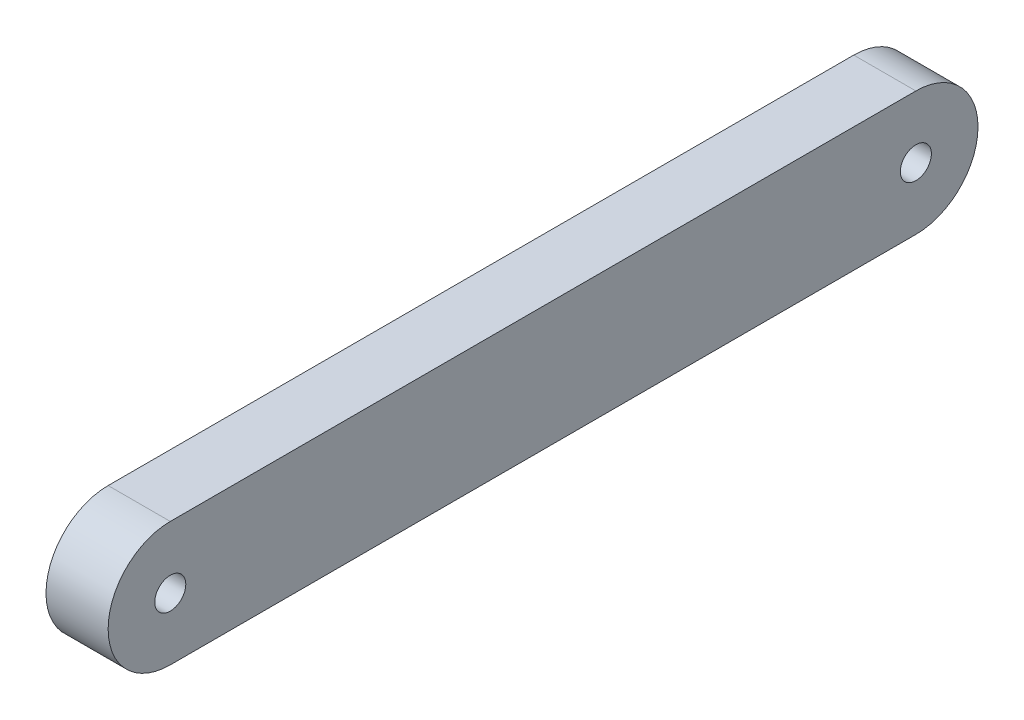
ISO-10303-21;
HEADER;
FILE_DESCRIPTION(('STEP AP214'),'2;1');
FILE_NAME('part.step','',(''),(''),'','','');
FILE_SCHEMA(('AUTOMOTIVE_DESIGN { 1 0 10303 214 1 1 1 1 }'));
ENDSEC;
DATA;
#1=APPLICATION_CONTEXT('core data for automotive mechanical design processes');
#2=APPLICATION_PROTOCOL_DEFINITION('international standard','automotive_design',2000,#1);
#3=PRODUCT_CONTEXT('',#1,'mechanical');
#4=PRODUCT('Part','Part','',(#3));
#5=PRODUCT_RELATED_PRODUCT_CATEGORY('part','',(#4));
#6=PRODUCT_DEFINITION_FORMATION('','',#4);
#7=PRODUCT_DEFINITION_CONTEXT('part definition',#1,'design');
#8=PRODUCT_DEFINITION('design','',#6,#7);
#9=PRODUCT_DEFINITION_SHAPE('','',#8);
#10=(LENGTH_UNIT() NAMED_UNIT(*) SI_UNIT(.MILLI.,.METRE.));
#11=(NAMED_UNIT(*) PLANE_ANGLE_UNIT() SI_UNIT($,.RADIAN.));
#12=(NAMED_UNIT(*) SI_UNIT($,.STERADIAN.) SOLID_ANGLE_UNIT());
#13=UNCERTAINTY_MEASURE_WITH_UNIT(LENGTH_MEASURE(1.E-05),#10,'distance_accuracy_value','');
#14=(GEOMETRIC_REPRESENTATION_CONTEXT(3) GLOBAL_UNCERTAINTY_ASSIGNED_CONTEXT((#13)) GLOBAL_UNIT_ASSIGNED_CONTEXT((#10,
#11,#12)) REPRESENTATION_CONTEXT('',''));
#15=CARTESIAN_POINT('',(0.,0.,0.));
#16=DIRECTION('',(0.,0.,1.));
#17=DIRECTION('',(1.,0.,0.));
#18=AXIS2_PLACEMENT_3D('',#15,#16,#17);
#19=CARTESIAN_POINT('',(12.7,0.,0.));
#20=DIRECTION('',(-1.,0.,0.));
#21=DIRECTION('',(0.,0.,1.));
#22=AXIS2_PLACEMENT_3D('',#19,#20,#21);
#23=CYLINDRICAL_SURFACE('',#22,12.7);
#24=CARTESIAN_POINT('',(0.,0.,0.));
#25=DIRECTION('',(1.,0.,0.));
#26=DIRECTION('',(0.,0.,-1.));
#27=AXIS2_PLACEMENT_3D('',#24,#25,#26);
#28=CIRCLE('',#27,12.7);
#29=CARTESIAN_POINT('',(0.,-12.7,0.));
#30=VERTEX_POINT('',#29);
#31=CARTESIAN_POINT('',(0.,12.7,0.));
#32=VERTEX_POINT('',#31);
#33=EDGE_CURVE('E104',#30,#32,#28,.T.);
#34=ORIENTED_EDGE('',*,*,#33,.T.);
#35=DIRECTION('',(-1.,0.,0.));
#36=VECTOR('',#35,1.);
#37=CARTESIAN_POINT('',(12.7,12.7,0.));
#38=LINE('',#37,#36);
#39=CARTESIAN_POINT('',(12.7,12.7,0.));
#40=VERTEX_POINT('',#39);
#41=EDGE_CURVE('E11',#40,#32,#38,.T.);
#42=ORIENTED_EDGE('',*,*,#41,.F.);
#43=CARTESIAN_POINT('',(12.7,0.,0.));
#44=DIRECTION('',(1.,0.,0.));
#45=DIRECTION('',(0.,0.,-1.));
#46=AXIS2_PLACEMENT_3D('',#43,#44,#45);
#47=CIRCLE('',#46,12.7);
#48=CARTESIAN_POINT('',(12.7,-12.7,0.));
#49=VERTEX_POINT('',#48);
#50=EDGE_CURVE('E92',#49,#40,#47,.T.);
#51=ORIENTED_EDGE('',*,*,#50,.F.);
#52=DIRECTION('',(-1.,0.,0.));
#53=VECTOR('',#52,1.);
#54=CARTESIAN_POINT('',(12.7,-12.7,0.));
#55=LINE('',#54,#53);
#56=EDGE_CURVE('E100',#49,#30,#55,.T.);
#57=ORIENTED_EDGE('',*,*,#56,.T.);
#58=EDGE_LOOP('',(#34,#42,#51,#57));
#59=FACE_BOUND('',#58,.T.);
#60=ADVANCED_FACE('F41',(#59),#23,.T.);
#61=CARTESIAN_POINT('',(12.7,12.7,0.));
#62=DIRECTION('',(0.,-1.,0.));
#63=DIRECTION('',(0.,0.,-1.));
#64=AXIS2_PLACEMENT_3D('',#61,#62,#63);
#65=PLANE('',#64);
#66=DIRECTION('',(0.,0.,1.));
#67=VECTOR('',#66,1.);
#68=CARTESIAN_POINT('',(0.,12.7,0.));
#69=LINE('',#68,#67);
#70=CARTESIAN_POINT('',(0.,12.7,152.4));
#71=VERTEX_POINT('',#70);
#72=EDGE_CURVE('E96',#32,#71,#69,.T.);
#73=ORIENTED_EDGE('',*,*,#72,.T.);
#74=DIRECTION('',(-1.,0.,0.));
#75=VECTOR('',#74,1.);
#76=CARTESIAN_POINT('',(12.7,12.7,152.4));
#77=LINE('',#76,#75);
#78=CARTESIAN_POINT('',(12.7,12.7,152.4));
#79=VERTEX_POINT('',#78);
#80=EDGE_CURVE('E49',#79,#71,#77,.T.);
#81=ORIENTED_EDGE('',*,*,#80,.F.);
#82=DIRECTION('',(0.,0.,1.));
#83=VECTOR('',#82,1.);
#84=CARTESIAN_POINT('',(12.7,12.7,0.));
#85=LINE('',#84,#83);
#86=EDGE_CURVE('E87',#40,#79,#85,.T.);
#87=ORIENTED_EDGE('',*,*,#86,.F.);
#88=ORIENTED_EDGE('',*,*,#41,.T.);
#89=EDGE_LOOP('',(#73,#81,#87,#88));
#90=FACE_BOUND('',#89,.T.);
#91=ADVANCED_FACE('F95',(#90),#65,.F.);
#92=CARTESIAN_POINT('',(12.7,0.,152.4));
#93=DIRECTION('',(-1.,0.,0.));
#94=DIRECTION('',(0.,0.,1.));
#95=AXIS2_PLACEMENT_3D('',#92,#93,#94);
#96=CYLINDRICAL_SURFACE('',#95,12.7);
#97=CARTESIAN_POINT('',(0.,0.,152.4));
#98=DIRECTION('',(1.,0.,0.));
#99=DIRECTION('',(0.,0.,-1.));
#100=AXIS2_PLACEMENT_3D('',#97,#98,#99);
#101=CIRCLE('',#100,12.7);
#102=CARTESIAN_POINT('',(0.,-12.7,152.4));
#103=VERTEX_POINT('',#102);
#104=EDGE_CURVE('E74',#71,#103,#101,.T.);
#105=ORIENTED_EDGE('',*,*,#104,.T.);
#106=DIRECTION('',(-1.,0.,0.));
#107=VECTOR('',#106,1.);
#108=CARTESIAN_POINT('',(12.7,-12.7,152.4));
#109=LINE('',#108,#107);
#110=CARTESIAN_POINT('',(12.7,-12.7,152.4));
#111=VERTEX_POINT('',#110);
#112=EDGE_CURVE('E97',#111,#103,#109,.T.);
#113=ORIENTED_EDGE('',*,*,#112,.F.);
#114=CARTESIAN_POINT('',(12.7,0.,152.4));
#115=DIRECTION('',(1.,0.,0.));
#116=DIRECTION('',(0.,0.,-1.));
#117=AXIS2_PLACEMENT_3D('',#114,#115,#116);
#118=CIRCLE('',#117,12.7);
#119=EDGE_CURVE('E90',#79,#111,#118,.T.);
#120=ORIENTED_EDGE('',*,*,#119,.F.);
#121=ORIENTED_EDGE('',*,*,#80,.T.);
#122=EDGE_LOOP('',(#105,#113,#120,#121));
#123=FACE_BOUND('',#122,.T.);
#124=ADVANCED_FACE('F98',(#123),#96,.T.);
#125=CARTESIAN_POINT('',(12.7,-12.7,0.));
#126=DIRECTION('',(0.,1.,0.));
#127=DIRECTION('',(0.,0.,1.));
#128=AXIS2_PLACEMENT_3D('',#125,#126,#127);
#129=PLANE('',#128);
#130=DIRECTION('',(0.,0.,-1.));
#131=VECTOR('',#130,1.);
#132=CARTESIAN_POINT('',(0.,-12.7,0.));
#133=LINE('',#132,#131);
#134=EDGE_CURVE('E80',#103,#30,#133,.T.);
#135=ORIENTED_EDGE('',*,*,#134,.T.);
#136=ORIENTED_EDGE('',*,*,#56,.F.);
#137=DIRECTION('',(0.,0.,-1.));
#138=VECTOR('',#137,1.);
#139=CARTESIAN_POINT('',(12.7,-12.7,0.));
#140=LINE('',#139,#138);
#141=EDGE_CURVE('E57',#111,#49,#140,.T.);
#142=ORIENTED_EDGE('',*,*,#141,.F.);
#143=ORIENTED_EDGE('',*,*,#112,.T.);
#144=EDGE_LOOP('',(#135,#136,#142,#143));
#145=FACE_BOUND('',#144,.T.);
#146=ADVANCED_FACE('F112',(#145),#129,.F.);
#147=CARTESIAN_POINT('',(12.7,0.,0.));
#148=DIRECTION('',(1.,0.,0.));
#149=DIRECTION('',(0.,0.,-1.));
#150=AXIS2_PLACEMENT_3D('',#147,#148,#149);
#151=PLANE('',#150);
#152=CARTESIAN_POINT('',(12.7,0.,0.));
#153=DIRECTION('',(1.,0.,0.));
#154=DIRECTION('',(0.,0.,-1.));
#155=AXIS2_PLACEMENT_3D('',#152,#153,#154);
#156=CIRCLE('',#155,3.175);
#157=CARTESIAN_POINT('',(12.7,0.,-3.175));
#158=VERTEX_POINT('',#157);
#159=EDGE_CURVE('E124',#158,#158,#156,.T.);
#160=ORIENTED_EDGE('',*,*,#159,.F.);
#161=EDGE_LOOP('',(#160));
#162=FACE_BOUND('',#161,.T.);
#163=CARTESIAN_POINT('',(12.7,0.,152.4));
#164=DIRECTION('',(1.,0.,0.));
#165=DIRECTION('',(0.,0.,-1.));
#166=AXIS2_PLACEMENT_3D('',#163,#164,#165);
#167=CIRCLE('',#166,3.175);
#168=CARTESIAN_POINT('',(12.7,0.,149.225));
#169=VERTEX_POINT('',#168);
#170=EDGE_CURVE('E121',#169,#169,#167,.T.);
#171=ORIENTED_EDGE('',*,*,#170,.F.);
#172=EDGE_LOOP('',(#171));
#173=FACE_BOUND('',#172,.T.);
#174=ORIENTED_EDGE('',*,*,#50,.T.);
#175=ORIENTED_EDGE('',*,*,#86,.T.);
#176=ORIENTED_EDGE('',*,*,#119,.T.);
#177=ORIENTED_EDGE('',*,*,#141,.T.);
#178=EDGE_LOOP('',(#174,#175,#176,#177));
#179=FACE_BOUND('',#178,.T.);
#180=ADVANCED_FACE('F88',(#162,#173,#179),#151,.T.);
#181=CARTESIAN_POINT('',(0.,0.,0.));
#182=DIRECTION('',(1.,0.,0.));
#183=DIRECTION('',(0.,0.,-1.));
#184=AXIS2_PLACEMENT_3D('',#181,#182,#183);
#185=PLANE('',#184);
#186=CARTESIAN_POINT('',(0.,0.,0.));
#187=DIRECTION('',(1.,0.,0.));
#188=DIRECTION('',(0.,0.,-1.));
#189=AXIS2_PLACEMENT_3D('',#186,#187,#188);
#190=CIRCLE('',#189,3.175);
#191=CARTESIAN_POINT('',(0.,0.,-3.175));
#192=VERTEX_POINT('',#191);
#193=EDGE_CURVE('E107',#192,#192,#190,.T.);
#194=ORIENTED_EDGE('',*,*,#193,.T.);
#195=EDGE_LOOP('',(#194));
#196=FACE_BOUND('',#195,.T.);
#197=CARTESIAN_POINT('',(0.,0.,152.4));
#198=DIRECTION('',(1.,0.,0.));
#199=DIRECTION('',(0.,0.,-1.));
#200=AXIS2_PLACEMENT_3D('',#197,#198,#199);
#201=CIRCLE('',#200,3.175);
#202=CARTESIAN_POINT('',(0.,0.,149.225));
#203=VERTEX_POINT('',#202);
#204=EDGE_CURVE('E118',#203,#203,#201,.T.);
#205=ORIENTED_EDGE('',*,*,#204,.T.);
#206=EDGE_LOOP('',(#205));
#207=FACE_BOUND('',#206,.T.);
#208=ORIENTED_EDGE('',*,*,#33,.F.);
#209=ORIENTED_EDGE('',*,*,#134,.F.);
#210=ORIENTED_EDGE('',*,*,#104,.F.);
#211=ORIENTED_EDGE('',*,*,#72,.F.);
#212=EDGE_LOOP('',(#208,#209,#210,#211));
#213=FACE_BOUND('',#212,.T.);
#214=ADVANCED_FACE('F115',(#196,#207,#213),#185,.F.);
#215=CARTESIAN_POINT('',(0.,0.,152.4));
#216=DIRECTION('',(1.,0.,0.));
#217=DIRECTION('',(0.,0.,-1.));
#218=AXIS2_PLACEMENT_3D('',#215,#216,#217);
#219=CYLINDRICAL_SURFACE('',#218,3.175);
#220=CARTESIAN_POINT('',(0.,0.,149.225));
#221=CARTESIAN_POINT('',(0.132291666666667,0.,149.225));
#222=CARTESIAN_POINT('',(0.264583333333333,0.,149.225));
#223=CARTESIAN_POINT('',(0.529166666666667,0.,149.225));
#224=CARTESIAN_POINT('',(0.661458333333333,0.,149.225));
#225=CARTESIAN_POINT('',(0.926041666666667,0.,149.225));
#226=CARTESIAN_POINT('',(1.05833333333333,0.,149.225));
#227=CARTESIAN_POINT('',(1.32291666666667,0.,149.225));
#228=CARTESIAN_POINT('',(1.45520833333333,0.,149.225));
#229=CARTESIAN_POINT('',(1.71979166666667,0.,149.225));
#230=CARTESIAN_POINT('',(1.85208333333333,0.,149.225));
#231=CARTESIAN_POINT('',(2.11666666666667,0.,149.225));
#232=CARTESIAN_POINT('',(2.24895833333333,0.,149.225));
#233=CARTESIAN_POINT('',(2.51354166666667,0.,149.225));
#234=CARTESIAN_POINT('',(2.64583333333333,0.,149.225));
#235=CARTESIAN_POINT('',(2.91041666666667,0.,149.225));
#236=CARTESIAN_POINT('',(3.04270833333333,0.,149.225));
#237=CARTESIAN_POINT('',(3.30729166666667,0.,149.225));
#238=CARTESIAN_POINT('',(3.43958333333333,0.,149.225));
#239=CARTESIAN_POINT('',(3.70416666666667,0.,149.225));
#240=CARTESIAN_POINT('',(3.83645833333333,0.,149.225));
#241=CARTESIAN_POINT('',(4.10104166666667,0.,149.225));
#242=CARTESIAN_POINT('',(4.23333333333333,0.,149.225));
#243=CARTESIAN_POINT('',(4.49791666666667,0.,149.225));
#244=CARTESIAN_POINT('',(4.63020833333333,0.,149.225));
#245=CARTESIAN_POINT('',(4.89479166666667,0.,149.225));
#246=CARTESIAN_POINT('',(5.02708333333333,0.,149.225));
#247=CARTESIAN_POINT('',(5.29166666666667,0.,149.225));
#248=CARTESIAN_POINT('',(5.42395833333333,0.,149.225));
#249=CARTESIAN_POINT('',(5.68854166666667,0.,149.225));
#250=CARTESIAN_POINT('',(5.82083333333333,0.,149.225));
#251=CARTESIAN_POINT('',(6.08541666666667,0.,149.225));
#252=CARTESIAN_POINT('',(6.21770833333333,0.,149.225));
#253=CARTESIAN_POINT('',(6.48229166666667,0.,149.225));
#254=CARTESIAN_POINT('',(6.61458333333333,0.,149.225));
#255=CARTESIAN_POINT('',(6.87916666666667,0.,149.225));
#256=CARTESIAN_POINT('',(7.01145833333333,0.,149.225));
#257=CARTESIAN_POINT('',(7.27604166666667,0.,149.225));
#258=CARTESIAN_POINT('',(7.40833333333333,0.,149.225));
#259=CARTESIAN_POINT('',(7.67291666666667,0.,149.225));
#260=CARTESIAN_POINT('',(7.80520833333333,0.,149.225));
#261=CARTESIAN_POINT('',(8.06979166666667,0.,149.225));
#262=CARTESIAN_POINT('',(8.20208333333333,0.,149.225));
#263=CARTESIAN_POINT('',(8.46666666666667,0.,149.225));
#264=CARTESIAN_POINT('',(8.59895833333333,0.,149.225));
#265=CARTESIAN_POINT('',(8.86354166666667,0.,149.225));
#266=CARTESIAN_POINT('',(8.99583333333334,0.,149.225));
#267=CARTESIAN_POINT('',(9.26041666666667,0.,149.225));
#268=CARTESIAN_POINT('',(9.39270833333333,0.,149.225));
#269=CARTESIAN_POINT('',(9.65729166666667,0.,149.225));
#270=CARTESIAN_POINT('',(9.78958333333333,0.,149.225));
#271=CARTESIAN_POINT('',(10.0541666666667,0.,149.225));
#272=CARTESIAN_POINT('',(10.1864583333333,0.,149.225));
#273=CARTESIAN_POINT('',(10.4510416666667,0.,149.225));
#274=CARTESIAN_POINT('',(10.5833333333333,0.,149.225));
#275=CARTESIAN_POINT('',(10.8479166666667,0.,149.225));
#276=CARTESIAN_POINT('',(10.9802083333333,0.,149.225));
#277=CARTESIAN_POINT('',(11.2447916666667,0.,149.225));
#278=CARTESIAN_POINT('',(11.3770833333333,0.,149.225));
#279=CARTESIAN_POINT('',(11.6416666666667,0.,149.225));
#280=CARTESIAN_POINT('',(11.7739583333333,0.,149.225));
#281=CARTESIAN_POINT('',(12.0385416666667,0.,149.225));
#282=CARTESIAN_POINT('',(12.1708333333333,0.,149.225));
#283=CARTESIAN_POINT('',(12.4354166666667,0.,149.225));
#284=CARTESIAN_POINT('',(12.5677083333333,0.,149.225));
#285=CARTESIAN_POINT('',(12.7,0.,149.225));
#286=B_SPLINE_CURVE_WITH_KNOTS('',3,(#220,#221,#222,#223,#224,#225,#226,#227,#228,#229,#230,
#231,#232,#233,#234,#235,#236,#237,#238,#239,#240,#241,#242,#243,#244,#245,#246,#247,#248,#249,
#250,#251,#252,#253,#254,#255,#256,#257,#258,#259,#260,#261,#262,#263,#264,#265,#266,#267,#268,
#269,#270,#271,#272,#273,#274,#275,#276,#277,#278,#279,#280,#281,#282,#283,#284,#285),
.UNSPECIFIED.,.F.,.F.,(4,2,2,2,2,2,2,2,2,2,2,2,2,2,2,2,2,2,2,2,2,2,2,2,2,2,2,2,2,2,2,2,4),(0.,
0.396875,0.79375,1.190625,1.5875,1.984375,2.38125,2.778125,3.175,3.571875,3.96875,4.365625,
4.7625,5.159375,5.55625,5.953125,6.35,6.746875,7.14375,7.540625,7.9375,8.334375,8.73125,
9.128125,9.525,9.921875,10.31875,10.715625,11.1125,11.509375,11.90625,12.303125,12.7),.UNSPECIFIED.);
#287=EDGE_CURVE('BSEAM135',#203,#169,#286,.T.);
#288=ORIENTED_EDGE('',*,*,#204,.F.);
#289=ORIENTED_EDGE('',*,*,#170,.T.);
#290=ORIENTED_EDGE('',*,*,#287,.T.);
#291=ORIENTED_EDGE('',*,*,#287,.F.);
#292=EDGE_LOOP('',(#288,#290,#289,#291));
#293=FACE_BOUND('',#292,.T.);
#294=ADVANCED_FACE('F135',(#293),#219,.F.);
#295=CARTESIAN_POINT('',(0.,0.,0.));
#296=DIRECTION('',(1.,0.,0.));
#297=DIRECTION('',(0.,0.,-1.));
#298=AXIS2_PLACEMENT_3D('',#295,#296,#297);
#299=CYLINDRICAL_SURFACE('',#298,3.175);
#300=CARTESIAN_POINT('',(0.,0.,-3.175));
#301=CARTESIAN_POINT('',(0.132291666666667,0.,-3.175));
#302=CARTESIAN_POINT('',(0.264583333333333,0.,-3.175));
#303=CARTESIAN_POINT('',(0.529166666666667,0.,-3.175));
#304=CARTESIAN_POINT('',(0.661458333333333,0.,-3.175));
#305=CARTESIAN_POINT('',(0.926041666666667,0.,-3.175));
#306=CARTESIAN_POINT('',(1.05833333333333,0.,-3.175));
#307=CARTESIAN_POINT('',(1.32291666666667,0.,-3.175));
#308=CARTESIAN_POINT('',(1.45520833333333,0.,-3.175));
#309=CARTESIAN_POINT('',(1.71979166666667,0.,-3.175));
#310=CARTESIAN_POINT('',(1.85208333333333,0.,-3.175));
#311=CARTESIAN_POINT('',(2.11666666666667,0.,-3.175));
#312=CARTESIAN_POINT('',(2.24895833333333,0.,-3.175));
#313=CARTESIAN_POINT('',(2.51354166666667,0.,-3.175));
#314=CARTESIAN_POINT('',(2.64583333333333,0.,-3.175));
#315=CARTESIAN_POINT('',(2.91041666666667,0.,-3.175));
#316=CARTESIAN_POINT('',(3.04270833333333,0.,-3.175));
#317=CARTESIAN_POINT('',(3.30729166666667,0.,-3.175));
#318=CARTESIAN_POINT('',(3.43958333333333,0.,-3.175));
#319=CARTESIAN_POINT('',(3.70416666666667,0.,-3.175));
#320=CARTESIAN_POINT('',(3.83645833333333,0.,-3.175));
#321=CARTESIAN_POINT('',(4.10104166666667,0.,-3.175));
#322=CARTESIAN_POINT('',(4.23333333333333,0.,-3.175));
#323=CARTESIAN_POINT('',(4.49791666666667,0.,-3.175));
#324=CARTESIAN_POINT('',(4.63020833333333,0.,-3.175));
#325=CARTESIAN_POINT('',(4.89479166666667,0.,-3.175));
#326=CARTESIAN_POINT('',(5.02708333333333,0.,-3.175));
#327=CARTESIAN_POINT('',(5.29166666666667,0.,-3.175));
#328=CARTESIAN_POINT('',(5.42395833333333,0.,-3.175));
#329=CARTESIAN_POINT('',(5.68854166666667,0.,-3.175));
#330=CARTESIAN_POINT('',(5.82083333333333,0.,-3.175));
#331=CARTESIAN_POINT('',(6.08541666666667,0.,-3.175));
#332=CARTESIAN_POINT('',(6.21770833333333,0.,-3.175));
#333=CARTESIAN_POINT('',(6.48229166666667,0.,-3.175));
#334=CARTESIAN_POINT('',(6.61458333333333,0.,-3.175));
#335=CARTESIAN_POINT('',(6.87916666666667,0.,-3.175));
#336=CARTESIAN_POINT('',(7.01145833333333,0.,-3.175));
#337=CARTESIAN_POINT('',(7.27604166666667,0.,-3.175));
#338=CARTESIAN_POINT('',(7.40833333333333,0.,-3.175));
#339=CARTESIAN_POINT('',(7.67291666666667,0.,-3.175));
#340=CARTESIAN_POINT('',(7.80520833333333,0.,-3.175));
#341=CARTESIAN_POINT('',(8.06979166666667,0.,-3.175));
#342=CARTESIAN_POINT('',(8.20208333333333,0.,-3.175));
#343=CARTESIAN_POINT('',(8.46666666666667,0.,-3.175));
#344=CARTESIAN_POINT('',(8.59895833333333,0.,-3.175));
#345=CARTESIAN_POINT('',(8.86354166666667,0.,-3.175));
#346=CARTESIAN_POINT('',(8.99583333333334,0.,-3.175));
#347=CARTESIAN_POINT('',(9.26041666666667,0.,-3.175));
#348=CARTESIAN_POINT('',(9.39270833333333,0.,-3.175));
#349=CARTESIAN_POINT('',(9.65729166666667,0.,-3.175));
#350=CARTESIAN_POINT('',(9.78958333333333,0.,-3.175));
#351=CARTESIAN_POINT('',(10.0541666666667,0.,-3.175));
#352=CARTESIAN_POINT('',(10.1864583333333,0.,-3.175));
#353=CARTESIAN_POINT('',(10.4510416666667,0.,-3.175));
#354=CARTESIAN_POINT('',(10.5833333333333,0.,-3.175));
#355=CARTESIAN_POINT('',(10.8479166666667,0.,-3.175));
#356=CARTESIAN_POINT('',(10.9802083333333,0.,-3.175));
#357=CARTESIAN_POINT('',(11.2447916666667,0.,-3.175));
#358=CARTESIAN_POINT('',(11.3770833333333,0.,-3.175));
#359=CARTESIAN_POINT('',(11.6416666666667,0.,-3.175));
#360=CARTESIAN_POINT('',(11.7739583333333,0.,-3.175));
#361=CARTESIAN_POINT('',(12.0385416666667,0.,-3.175));
#362=CARTESIAN_POINT('',(12.1708333333333,0.,-3.175));
#363=CARTESIAN_POINT('',(12.4354166666667,0.,-3.175));
#364=CARTESIAN_POINT('',(12.5677083333333,0.,-3.175));
#365=CARTESIAN_POINT('',(12.7,0.,-3.175));
#366=B_SPLINE_CURVE_WITH_KNOTS('',3,(#300,#301,#302,#303,#304,#305,#306,#307,#308,#309,#310,
#311,#312,#313,#314,#315,#316,#317,#318,#319,#320,#321,#322,#323,#324,#325,#326,#327,#328,#329,
#330,#331,#332,#333,#334,#335,#336,#337,#338,#339,#340,#341,#342,#343,#344,#345,#346,#347,#348,
#349,#350,#351,#352,#353,#354,#355,#356,#357,#358,#359,#360,#361,#362,#363,#364,#365),
.UNSPECIFIED.,.F.,.F.,(4,2,2,2,2,2,2,2,2,2,2,2,2,2,2,2,2,2,2,2,2,2,2,2,2,2,2,2,2,2,2,2,4),(0.,
0.396875,0.79375,1.190625,1.5875,1.984375,2.38125,2.778125,3.175,3.571875,3.96875,4.365625,
4.7625,5.159375,5.55625,5.953125,6.35,6.746875,7.14375,7.540625,7.9375,8.334375,8.73125,
9.128125,9.525,9.921875,10.31875,10.715625,11.1125,11.509375,11.90625,12.303125,12.7),.UNSPECIFIED.);
#367=EDGE_CURVE('BSEAM132',#192,#158,#366,.T.);
#368=ORIENTED_EDGE('',*,*,#193,.F.);
#369=ORIENTED_EDGE('',*,*,#159,.T.);
#370=ORIENTED_EDGE('',*,*,#367,.T.);
#371=ORIENTED_EDGE('',*,*,#367,.F.);
#372=EDGE_LOOP('',(#368,#370,#369,#371));
#373=FACE_BOUND('',#372,.T.);
#374=ADVANCED_FACE('F132',(#373),#299,.F.);
#375=CLOSED_SHELL('',(#60,#91,#124,#146,#180,#214,#294,#374));
#376=MANIFOLD_SOLID_BREP('B2',#375);
#377=ADVANCED_BREP_SHAPE_REPRESENTATION('',(#18,#376),#14);
#378=SHAPE_DEFINITION_REPRESENTATION(#9,#377);
ENDSEC;
END-ISO-10303-21;
